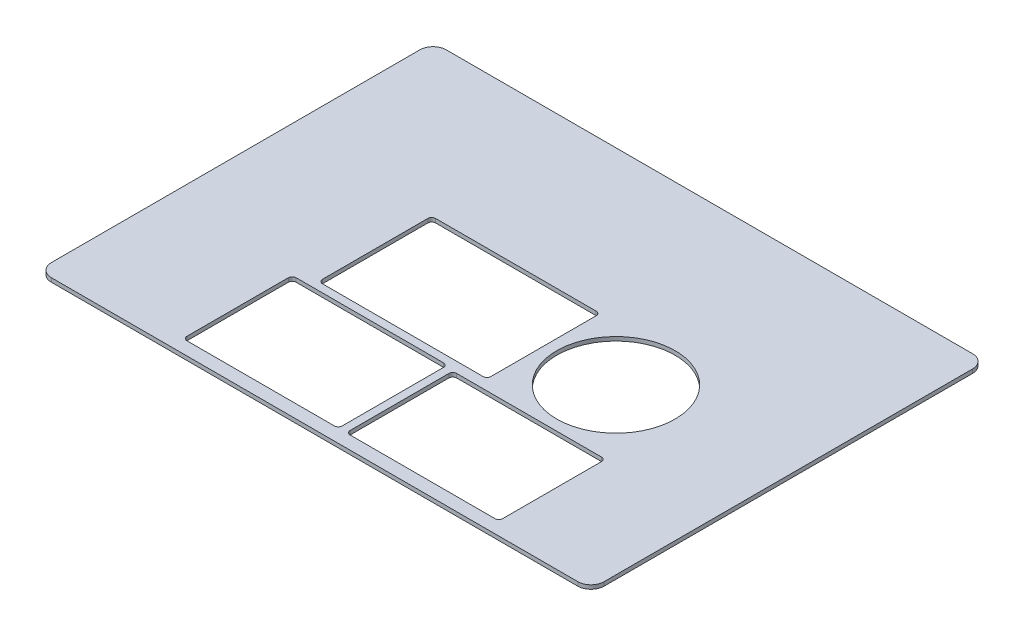
ISO-10303-21;
HEADER;
FILE_DESCRIPTION(('STEP AP214'),'2;1');
FILE_NAME('part.step','',(''),(''),'','','');
FILE_SCHEMA(('AUTOMOTIVE_DESIGN { 1 0 10303 214 1 1 1 1 }'));
ENDSEC;
DATA;
#1=APPLICATION_CONTEXT('core data for automotive mechanical design processes');
#2=APPLICATION_PROTOCOL_DEFINITION('international standard','automotive_design',2000,#1);
#3=PRODUCT_CONTEXT('',#1,'mechanical');
#4=PRODUCT('Part','Part','',(#3));
#5=PRODUCT_RELATED_PRODUCT_CATEGORY('part','',(#4));
#6=PRODUCT_DEFINITION_FORMATION('','',#4);
#7=PRODUCT_DEFINITION_CONTEXT('part definition',#1,'design');
#8=PRODUCT_DEFINITION('design','',#6,#7);
#9=PRODUCT_DEFINITION_SHAPE('','',#8);
#10=(LENGTH_UNIT() NAMED_UNIT(*) SI_UNIT(.MILLI.,.METRE.));
#11=(NAMED_UNIT(*) PLANE_ANGLE_UNIT() SI_UNIT($,.RADIAN.));
#12=(NAMED_UNIT(*) SI_UNIT($,.STERADIAN.) SOLID_ANGLE_UNIT());
#13=UNCERTAINTY_MEASURE_WITH_UNIT(LENGTH_MEASURE(1.E-05),#10,'distance_accuracy_value','');
#14=(GEOMETRIC_REPRESENTATION_CONTEXT(3) GLOBAL_UNCERTAINTY_ASSIGNED_CONTEXT((#13)) GLOBAL_UNIT_ASSIGNED_CONTEXT((#10,
#11,#12)) REPRESENTATION_CONTEXT('',''));
#15=CARTESIAN_POINT('',(0.,0.,0.));
#16=DIRECTION('',(0.,0.,1.));
#17=DIRECTION('',(1.,0.,0.));
#18=AXIS2_PLACEMENT_3D('',#15,#16,#17);
#19=CARTESIAN_POINT('',(-200.,3.,-140.));
#20=DIRECTION('',(0.,-1.,0.));
#21=DIRECTION('',(0.,0.,-1.));
#22=AXIS2_PLACEMENT_3D('',#19,#20,#21);
#23=CYLINDRICAL_SURFACE('',#22,10.);
#24=DIRECTION('',(0.,-1.,0.));
#25=VECTOR('',#24,1.);
#26=CARTESIAN_POINT('',(-210.,3.,-140.));
#27=LINE('',#26,#25);
#28=CARTESIAN_POINT('',(-210.,3.,-140.));
#29=VERTEX_POINT('',#28);
#30=CARTESIAN_POINT('',(-210.,0.,-140.));
#31=VERTEX_POINT('',#30);
#32=EDGE_CURVE('E581',#29,#31,#27,.T.);
#33=ORIENTED_EDGE('',*,*,#32,.F.);
#34=CARTESIAN_POINT('',(-200.,3.,-140.));
#35=DIRECTION('',(0.,-1.,0.));
#36=DIRECTION('',(0.,0.,-1.));
#37=AXIS2_PLACEMENT_3D('',#34,#35,#36);
#38=CIRCLE('',#37,10.);
#39=CARTESIAN_POINT('',(-200.,3.,-150.));
#40=VERTEX_POINT('',#39);
#41=EDGE_CURVE('E46',#40,#29,#38,.F.);
#42=ORIENTED_EDGE('',*,*,#41,.F.);
#43=DIRECTION('',(0.,-1.,0.));
#44=VECTOR('',#43,1.);
#45=CARTESIAN_POINT('',(-200.,3.,-150.));
#46=LINE('',#45,#44);
#47=CARTESIAN_POINT('',(-200.,0.,-150.));
#48=VERTEX_POINT('',#47);
#49=EDGE_CURVE('E585',#48,#40,#46,.F.);
#50=ORIENTED_EDGE('',*,*,#49,.F.);
#51=CARTESIAN_POINT('',(-200.,0.,-140.));
#52=DIRECTION('',(0.,-1.,0.));
#53=DIRECTION('',(0.,0.,-1.));
#54=AXIS2_PLACEMENT_3D('',#51,#52,#53);
#55=CIRCLE('',#54,10.);
#56=EDGE_CURVE('E11',#31,#48,#55,.T.);
#57=ORIENTED_EDGE('',*,*,#56,.F.);
#58=EDGE_LOOP('',(#33,#42,#50,#57));
#59=FACE_BOUND('',#58,.T.);
#60=ADVANCED_FACE('F38',(#59),#23,.T.);
#61=CARTESIAN_POINT('',(200.,3.,-140.));
#62=DIRECTION('',(0.,-1.,0.));
#63=DIRECTION('',(0.,0.,-1.));
#64=AXIS2_PLACEMENT_3D('',#61,#62,#63);
#65=CYLINDRICAL_SURFACE('',#64,10.);
#66=DIRECTION('',(0.,-1.,0.));
#67=VECTOR('',#66,1.);
#68=CARTESIAN_POINT('',(200.,3.,-150.));
#69=LINE('',#68,#67);
#70=CARTESIAN_POINT('',(200.,3.,-150.));
#71=VERTEX_POINT('',#70);
#72=CARTESIAN_POINT('',(200.,0.,-150.));
#73=VERTEX_POINT('',#72);
#74=EDGE_CURVE('E567',#71,#73,#69,.T.);
#75=ORIENTED_EDGE('',*,*,#74,.F.);
#76=CARTESIAN_POINT('',(200.,3.,-140.));
#77=DIRECTION('',(0.,-1.,0.));
#78=DIRECTION('',(0.,0.,-1.));
#79=AXIS2_PLACEMENT_3D('',#76,#77,#78);
#80=CIRCLE('',#79,10.);
#81=CARTESIAN_POINT('',(210.,3.,-140.));
#82=VERTEX_POINT('',#81);
#83=EDGE_CURVE('E575',#82,#71,#80,.F.);
#84=ORIENTED_EDGE('',*,*,#83,.F.);
#85=DIRECTION('',(0.,-1.,0.));
#86=VECTOR('',#85,1.);
#87=CARTESIAN_POINT('',(210.,3.,-140.));
#88=LINE('',#87,#86);
#89=CARTESIAN_POINT('',(210.,0.,-140.));
#90=VERTEX_POINT('',#89);
#91=EDGE_CURVE('E571',#90,#82,#88,.F.);
#92=ORIENTED_EDGE('',*,*,#91,.F.);
#93=CARTESIAN_POINT('',(200.,0.,-140.));
#94=DIRECTION('',(0.,-1.,0.));
#95=DIRECTION('',(0.,0.,-1.));
#96=AXIS2_PLACEMENT_3D('',#93,#94,#95);
#97=CIRCLE('',#96,10.);
#98=EDGE_CURVE('E578',#73,#90,#97,.T.);
#99=ORIENTED_EDGE('',*,*,#98,.F.);
#100=EDGE_LOOP('',(#75,#84,#92,#99));
#101=FACE_BOUND('',#100,.T.);
#102=ADVANCED_FACE('F615',(#101),#65,.T.);
#103=CARTESIAN_POINT('',(200.,3.,140.));
#104=DIRECTION('',(0.,1.,0.));
#105=DIRECTION('',(0.,0.,1.));
#106=AXIS2_PLACEMENT_3D('',#103,#104,#105);
#107=CYLINDRICAL_SURFACE('',#106,10.);
#108=DIRECTION('',(0.,1.,0.));
#109=VECTOR('',#108,1.);
#110=CARTESIAN_POINT('',(200.,3.,150.));
#111=LINE('',#110,#109);
#112=CARTESIAN_POINT('',(200.,0.,150.));
#113=VERTEX_POINT('',#112);
#114=CARTESIAN_POINT('',(200.,3.,150.));
#115=VERTEX_POINT('',#114);
#116=EDGE_CURVE('E553',#113,#115,#111,.T.);
#117=ORIENTED_EDGE('',*,*,#116,.F.);
#118=CARTESIAN_POINT('',(200.,0.,140.));
#119=DIRECTION('',(0.,-1.,0.));
#120=DIRECTION('',(0.,0.,-1.));
#121=AXIS2_PLACEMENT_3D('',#118,#119,#120);
#122=CIRCLE('',#121,10.);
#123=CARTESIAN_POINT('',(210.,0.,140.));
#124=VERTEX_POINT('',#123);
#125=EDGE_CURVE('E561',#124,#113,#122,.T.);
#126=ORIENTED_EDGE('',*,*,#125,.F.);
#127=DIRECTION('',(0.,1.,0.));
#128=VECTOR('',#127,1.);
#129=CARTESIAN_POINT('',(210.,3.,140.));
#130=LINE('',#129,#128);
#131=CARTESIAN_POINT('',(210.,3.,140.));
#132=VERTEX_POINT('',#131);
#133=EDGE_CURVE('E557',#132,#124,#130,.F.);
#134=ORIENTED_EDGE('',*,*,#133,.F.);
#135=CARTESIAN_POINT('',(200.,3.,140.));
#136=DIRECTION('',(0.,-1.,0.));
#137=DIRECTION('',(0.,0.,-1.));
#138=AXIS2_PLACEMENT_3D('',#135,#136,#137);
#139=CIRCLE('',#138,10.);
#140=EDGE_CURVE('E564',#115,#132,#139,.F.);
#141=ORIENTED_EDGE('',*,*,#140,.F.);
#142=EDGE_LOOP('',(#117,#126,#134,#141));
#143=FACE_BOUND('',#142,.T.);
#144=ADVANCED_FACE('F607',(#143),#107,.T.);
#145=CARTESIAN_POINT('',(-200.,3.,140.));
#146=DIRECTION('',(0.,-1.,0.));
#147=DIRECTION('',(0.,0.,-1.));
#148=AXIS2_PLACEMENT_3D('',#145,#146,#147);
#149=CYLINDRICAL_SURFACE('',#148,10.);
#150=DIRECTION('',(0.,-1.,0.));
#151=VECTOR('',#150,1.);
#152=CARTESIAN_POINT('',(-200.,3.,150.));
#153=LINE('',#152,#151);
#154=CARTESIAN_POINT('',(-200.,3.,150.));
#155=VERTEX_POINT('',#154);
#156=CARTESIAN_POINT('',(-200.,0.,150.));
#157=VERTEX_POINT('',#156);
#158=EDGE_CURVE('E538',#155,#157,#153,.T.);
#159=ORIENTED_EDGE('',*,*,#158,.F.);
#160=CARTESIAN_POINT('',(-200.,3.,140.));
#161=DIRECTION('',(0.,-1.,0.));
#162=DIRECTION('',(0.,0.,-1.));
#163=AXIS2_PLACEMENT_3D('',#160,#161,#162);
#164=CIRCLE('',#163,10.);
#165=CARTESIAN_POINT('',(-210.,3.,140.));
#166=VERTEX_POINT('',#165);
#167=EDGE_CURVE('E546',#166,#155,#164,.F.);
#168=ORIENTED_EDGE('',*,*,#167,.F.);
#169=DIRECTION('',(0.,-1.,0.));
#170=VECTOR('',#169,1.);
#171=CARTESIAN_POINT('',(-210.,3.,140.));
#172=LINE('',#171,#170);
#173=CARTESIAN_POINT('',(-210.,0.,140.));
#174=VERTEX_POINT('',#173);
#175=EDGE_CURVE('E542',#174,#166,#172,.F.);
#176=ORIENTED_EDGE('',*,*,#175,.F.);
#177=CARTESIAN_POINT('',(-200.,0.,140.));
#178=DIRECTION('',(0.,-1.,0.));
#179=DIRECTION('',(0.,0.,-1.));
#180=AXIS2_PLACEMENT_3D('',#177,#178,#179);
#181=CIRCLE('',#180,10.);
#182=EDGE_CURVE('E549',#157,#174,#181,.T.);
#183=ORIENTED_EDGE('',*,*,#182,.F.);
#184=EDGE_LOOP('',(#159,#168,#176,#183));
#185=FACE_BOUND('',#184,.T.);
#186=ADVANCED_FACE('F599',(#185),#149,.T.);
#187=CARTESIAN_POINT('',(-107.,3.,60.));
#188=DIRECTION('',(0.,1.,0.));
#189=DIRECTION('',(0.,0.,1.));
#190=AXIS2_PLACEMENT_3D('',#187,#188,#189);
#191=CYLINDRICAL_SURFACE('',#190,3.);
#192=DIRECTION('',(0.,-1.,0.));
#193=VECTOR('',#192,1.);
#194=CARTESIAN_POINT('',(-107.,3.,57.));
#195=LINE('',#194,#193);
#196=CARTESIAN_POINT('',(-107.,3.,57.));
#197=VERTEX_POINT('',#196);
#198=CARTESIAN_POINT('',(-107.,0.,57.));
#199=VERTEX_POINT('',#198);
#200=EDGE_CURVE('E524',#197,#199,#195,.T.);
#201=ORIENTED_EDGE('',*,*,#200,.F.);
#202=CARTESIAN_POINT('',(-107.,3.,60.));
#203=DIRECTION('',(0.,-1.,0.));
#204=DIRECTION('',(0.,0.,-1.));
#205=AXIS2_PLACEMENT_3D('',#202,#203,#204);
#206=CIRCLE('',#205,3.);
#207=CARTESIAN_POINT('',(-110.,3.,59.9999999999999));
#208=VERTEX_POINT('',#207);
#209=EDGE_CURVE('E532',#197,#208,#206,.F.);
#210=ORIENTED_EDGE('',*,*,#209,.T.);
#211=DIRECTION('',(0.,-1.,0.));
#212=VECTOR('',#211,1.);
#213=CARTESIAN_POINT('',(-110.,3.,60.));
#214=LINE('',#213,#212);
#215=CARTESIAN_POINT('',(-110.,0.,59.9999999999999));
#216=VERTEX_POINT('',#215);
#217=EDGE_CURVE('E528',#216,#208,#214,.F.);
#218=ORIENTED_EDGE('',*,*,#217,.F.);
#219=CARTESIAN_POINT('',(-107.,0.,60.));
#220=DIRECTION('',(0.,-1.,0.));
#221=DIRECTION('',(0.,0.,-1.));
#222=AXIS2_PLACEMENT_3D('',#219,#220,#221);
#223=CIRCLE('',#222,3.);
#224=EDGE_CURVE('E535',#216,#199,#223,.T.);
#225=ORIENTED_EDGE('',*,*,#224,.T.);
#226=EDGE_LOOP('',(#201,#210,#218,#225));
#227=FACE_BOUND('',#226,.T.);
#228=ADVANCED_FACE('F651',(#227),#191,.F.);
#229=CARTESIAN_POINT('',(-107.,3.,137.));
#230=DIRECTION('',(0.,1.,0.));
#231=DIRECTION('',(0.,0.,1.));
#232=AXIS2_PLACEMENT_3D('',#229,#230,#231);
#233=CYLINDRICAL_SURFACE('',#232,3.);
#234=DIRECTION('',(0.,-1.,0.));
#235=VECTOR('',#234,1.);
#236=CARTESIAN_POINT('',(-110.,3.,137.));
#237=LINE('',#236,#235);
#238=CARTESIAN_POINT('',(-110.,3.,137.));
#239=VERTEX_POINT('',#238);
#240=CARTESIAN_POINT('',(-110.,0.,137.));
#241=VERTEX_POINT('',#240);
#242=EDGE_CURVE('E509',#239,#241,#237,.T.);
#243=ORIENTED_EDGE('',*,*,#242,.F.);
#244=CARTESIAN_POINT('',(-107.,3.,137.));
#245=DIRECTION('',(0.,-1.,0.));
#246=DIRECTION('',(0.,0.,-1.));
#247=AXIS2_PLACEMENT_3D('',#244,#245,#246);
#248=CIRCLE('',#247,3.);
#249=CARTESIAN_POINT('',(-107.,3.,140.));
#250=VERTEX_POINT('',#249);
#251=EDGE_CURVE('E517',#239,#250,#248,.F.);
#252=ORIENTED_EDGE('',*,*,#251,.T.);
#253=DIRECTION('',(0.,-1.,0.));
#254=VECTOR('',#253,1.);
#255=CARTESIAN_POINT('',(-107.,3.,140.));
#256=LINE('',#255,#254);
#257=CARTESIAN_POINT('',(-107.,0.,140.));
#258=VERTEX_POINT('',#257);
#259=EDGE_CURVE('E513',#258,#250,#256,.F.);
#260=ORIENTED_EDGE('',*,*,#259,.F.);
#261=CARTESIAN_POINT('',(-107.,0.,137.));
#262=DIRECTION('',(0.,-1.,0.));
#263=DIRECTION('',(0.,0.,-1.));
#264=AXIS2_PLACEMENT_3D('',#261,#262,#263);
#265=CIRCLE('',#264,3.);
#266=EDGE_CURVE('E520',#258,#241,#265,.T.);
#267=ORIENTED_EDGE('',*,*,#266,.T.);
#268=EDGE_LOOP('',(#243,#252,#260,#267));
#269=FACE_BOUND('',#268,.T.);
#270=ADVANCED_FACE('F654',(#269),#233,.F.);
#271=CARTESIAN_POINT('',(5.,3.,60.));
#272=DIRECTION('',(0.,-1.,0.));
#273=DIRECTION('',(0.,0.,-1.));
#274=AXIS2_PLACEMENT_3D('',#271,#272,#273);
#275=CYLINDRICAL_SURFACE('',#274,3.);
#276=DIRECTION('',(0.,1.,0.));
#277=VECTOR('',#276,1.);
#278=CARTESIAN_POINT('',(5.,3.,57.));
#279=LINE('',#278,#277);
#280=CARTESIAN_POINT('',(4.99999999999999,0.,57.));
#281=VERTEX_POINT('',#280);
#282=CARTESIAN_POINT('',(4.99999999999999,3.,57.));
#283=VERTEX_POINT('',#282);
#284=EDGE_CURVE('E495',#281,#283,#279,.T.);
#285=ORIENTED_EDGE('',*,*,#284,.F.);
#286=CARTESIAN_POINT('',(5.,0.,60.));
#287=DIRECTION('',(0.,-1.,0.));
#288=DIRECTION('',(0.,0.,-1.));
#289=AXIS2_PLACEMENT_3D('',#286,#287,#288);
#290=CIRCLE('',#289,3.);
#291=CARTESIAN_POINT('',(8.,0.,59.9999999999999));
#292=VERTEX_POINT('',#291);
#293=EDGE_CURVE('E503',#281,#292,#290,.T.);
#294=ORIENTED_EDGE('',*,*,#293,.T.);
#295=DIRECTION('',(0.,1.,0.));
#296=VECTOR('',#295,1.);
#297=CARTESIAN_POINT('',(8.,3.,60.));
#298=LINE('',#297,#296);
#299=CARTESIAN_POINT('',(8.,3.,59.9999999999999));
#300=VERTEX_POINT('',#299);
#301=EDGE_CURVE('E499',#300,#292,#298,.F.);
#302=ORIENTED_EDGE('',*,*,#301,.F.);
#303=CARTESIAN_POINT('',(5.,3.,60.));
#304=DIRECTION('',(0.,-1.,0.));
#305=DIRECTION('',(0.,0.,-1.));
#306=AXIS2_PLACEMENT_3D('',#303,#304,#305);
#307=CIRCLE('',#306,3.);
#308=EDGE_CURVE('E506',#300,#283,#307,.F.);
#309=ORIENTED_EDGE('',*,*,#308,.T.);
#310=EDGE_LOOP('',(#285,#294,#302,#309));
#311=FACE_BOUND('',#310,.T.);
#312=ADVANCED_FACE('F658',(#311),#275,.F.);
#313=CARTESIAN_POINT('',(5.,3.,137.));
#314=DIRECTION('',(0.,-1.,0.));
#315=DIRECTION('',(0.,0.,-1.));
#316=AXIS2_PLACEMENT_3D('',#313,#314,#315);
#317=CYLINDRICAL_SURFACE('',#316,3.);
#318=DIRECTION('',(0.,1.,0.));
#319=VECTOR('',#318,1.);
#320=CARTESIAN_POINT('',(8.,3.,137.));
#321=LINE('',#320,#319);
#322=CARTESIAN_POINT('',(8.,0.,137.));
#323=VERTEX_POINT('',#322);
#324=CARTESIAN_POINT('',(8.,3.,137.));
#325=VERTEX_POINT('',#324);
#326=EDGE_CURVE('E480',#323,#325,#321,.T.);
#327=ORIENTED_EDGE('',*,*,#326,.F.);
#328=CARTESIAN_POINT('',(5.,0.,137.));
#329=DIRECTION('',(0.,-1.,0.));
#330=DIRECTION('',(0.,0.,-1.));
#331=AXIS2_PLACEMENT_3D('',#328,#329,#330);
#332=CIRCLE('',#331,3.);
#333=CARTESIAN_POINT('',(4.99999999999999,0.,140.));
#334=VERTEX_POINT('',#333);
#335=EDGE_CURVE('E488',#323,#334,#332,.T.);
#336=ORIENTED_EDGE('',*,*,#335,.T.);
#337=DIRECTION('',(0.,1.,0.));
#338=VECTOR('',#337,1.);
#339=CARTESIAN_POINT('',(5.,3.,140.));
#340=LINE('',#339,#338);
#341=CARTESIAN_POINT('',(4.99999999999999,3.,140.));
#342=VERTEX_POINT('',#341);
#343=EDGE_CURVE('E484',#342,#334,#340,.F.);
#344=ORIENTED_EDGE('',*,*,#343,.F.);
#345=CARTESIAN_POINT('',(5.,3.,137.));
#346=DIRECTION('',(0.,-1.,0.));
#347=DIRECTION('',(0.,0.,-1.));
#348=AXIS2_PLACEMENT_3D('',#345,#346,#347);
#349=CIRCLE('',#348,3.);
#350=EDGE_CURVE('E492',#342,#325,#349,.F.);
#351=ORIENTED_EDGE('',*,*,#350,.T.);
#352=EDGE_LOOP('',(#327,#336,#344,#351));
#353=FACE_BOUND('',#352,.T.);
#354=ADVANCED_FACE('F662',(#353),#317,.F.);
#355=CARTESIAN_POINT('',(127.,3.,137.));
#356=DIRECTION('',(0.,-1.,0.));
#357=DIRECTION('',(0.,0.,-1.));
#358=AXIS2_PLACEMENT_3D('',#355,#356,#357);
#359=CYLINDRICAL_SURFACE('',#358,3.);
#360=DIRECTION('',(0.,1.,0.));
#361=VECTOR('',#360,1.);
#362=CARTESIAN_POINT('',(130.,3.,137.));
#363=LINE('',#362,#361);
#364=CARTESIAN_POINT('',(130.,0.,137.));
#365=VERTEX_POINT('',#364);
#366=CARTESIAN_POINT('',(130.,3.,137.));
#367=VERTEX_POINT('',#366);
#368=EDGE_CURVE('E466',#365,#367,#363,.T.);
#369=ORIENTED_EDGE('',*,*,#368,.F.);
#370=CARTESIAN_POINT('',(127.,0.,137.));
#371=DIRECTION('',(0.,-1.,0.));
#372=DIRECTION('',(0.,0.,-1.));
#373=AXIS2_PLACEMENT_3D('',#370,#371,#372);
#374=CIRCLE('',#373,3.);
#375=CARTESIAN_POINT('',(127.,0.,140.));
#376=VERTEX_POINT('',#375);
#377=EDGE_CURVE('E474',#365,#376,#374,.T.);
#378=ORIENTED_EDGE('',*,*,#377,.T.);
#379=DIRECTION('',(0.,1.,0.));
#380=VECTOR('',#379,1.);
#381=CARTESIAN_POINT('',(127.,3.,140.));
#382=LINE('',#381,#380);
#383=CARTESIAN_POINT('',(127.,3.,140.));
#384=VERTEX_POINT('',#383);
#385=EDGE_CURVE('E470',#384,#376,#382,.F.);
#386=ORIENTED_EDGE('',*,*,#385,.F.);
#387=CARTESIAN_POINT('',(127.,3.,137.));
#388=DIRECTION('',(0.,-1.,0.));
#389=DIRECTION('',(0.,0.,-1.));
#390=AXIS2_PLACEMENT_3D('',#387,#388,#389);
#391=CIRCLE('',#390,3.);
#392=EDGE_CURVE('E477',#384,#367,#391,.F.);
#393=ORIENTED_EDGE('',*,*,#392,.T.);
#394=EDGE_LOOP('',(#369,#378,#386,#393));
#395=FACE_BOUND('',#394,.T.);
#396=ADVANCED_FACE('F666',(#395),#359,.F.);
#397=CARTESIAN_POINT('',(127.,3.,62.));
#398=DIRECTION('',(0.,1.,0.));
#399=DIRECTION('',(0.,0.,1.));
#400=AXIS2_PLACEMENT_3D('',#397,#398,#399);
#401=CYLINDRICAL_SURFACE('',#400,3.);
#402=DIRECTION('',(0.,-1.,0.));
#403=VECTOR('',#402,1.);
#404=CARTESIAN_POINT('',(130.,3.,62.));
#405=LINE('',#404,#403);
#406=CARTESIAN_POINT('',(130.,3.,62.));
#407=VERTEX_POINT('',#406);
#408=CARTESIAN_POINT('',(130.,0.,62.));
#409=VERTEX_POINT('',#408);
#410=EDGE_CURVE('E451',#407,#409,#405,.T.);
#411=ORIENTED_EDGE('',*,*,#410,.F.);
#412=CARTESIAN_POINT('',(127.,3.,62.));
#413=DIRECTION('',(0.,-1.,0.));
#414=DIRECTION('',(0.,0.,-1.));
#415=AXIS2_PLACEMENT_3D('',#412,#413,#414);
#416=CIRCLE('',#415,3.);
#417=CARTESIAN_POINT('',(127.,3.,59.));
#418=VERTEX_POINT('',#417);
#419=EDGE_CURVE('E459',#407,#418,#416,.F.);
#420=ORIENTED_EDGE('',*,*,#419,.T.);
#421=DIRECTION('',(0.,-1.,0.));
#422=VECTOR('',#421,1.);
#423=CARTESIAN_POINT('',(127.,3.,59.));
#424=LINE('',#423,#422);
#425=CARTESIAN_POINT('',(127.,0.,59.));
#426=VERTEX_POINT('',#425);
#427=EDGE_CURVE('E455',#426,#418,#424,.F.);
#428=ORIENTED_EDGE('',*,*,#427,.F.);
#429=CARTESIAN_POINT('',(127.,0.,62.));
#430=DIRECTION('',(0.,-1.,0.));
#431=DIRECTION('',(0.,0.,-1.));
#432=AXIS2_PLACEMENT_3D('',#429,#430,#431);
#433=CIRCLE('',#432,3.);
#434=EDGE_CURVE('E462',#426,#409,#433,.T.);
#435=ORIENTED_EDGE('',*,*,#434,.T.);
#436=EDGE_LOOP('',(#411,#420,#428,#435));
#437=FACE_BOUND('',#436,.T.);
#438=ADVANCED_FACE('F670',(#437),#401,.F.);
#439=CARTESIAN_POINT('',(17.,3.,62.));
#440=DIRECTION('',(0.,1.,0.));
#441=DIRECTION('',(0.,0.,1.));
#442=AXIS2_PLACEMENT_3D('',#439,#440,#441);
#443=CYLINDRICAL_SURFACE('',#442,3.);
#444=DIRECTION('',(0.,-1.,0.));
#445=VECTOR('',#444,1.);
#446=CARTESIAN_POINT('',(17.,3.,59.));
#447=LINE('',#446,#445);
#448=CARTESIAN_POINT('',(17.,3.,59.));
#449=VERTEX_POINT('',#448);
#450=CARTESIAN_POINT('',(17.,0.,59.));
#451=VERTEX_POINT('',#450);
#452=EDGE_CURVE('E436',#449,#451,#447,.T.);
#453=ORIENTED_EDGE('',*,*,#452,.F.);
#454=CARTESIAN_POINT('',(17.,3.,62.));
#455=DIRECTION('',(0.,-1.,0.));
#456=DIRECTION('',(0.,0.,-1.));
#457=AXIS2_PLACEMENT_3D('',#454,#455,#456);
#458=CIRCLE('',#457,3.);
#459=CARTESIAN_POINT('',(14.,3.,62.));
#460=VERTEX_POINT('',#459);
#461=EDGE_CURVE('E444',#449,#460,#458,.F.);
#462=ORIENTED_EDGE('',*,*,#461,.T.);
#463=DIRECTION('',(0.,-1.,0.));
#464=VECTOR('',#463,1.);
#465=CARTESIAN_POINT('',(14.,3.,62.));
#466=LINE('',#465,#464);
#467=CARTESIAN_POINT('',(14.,0.,62.));
#468=VERTEX_POINT('',#467);
#469=EDGE_CURVE('E440',#468,#460,#466,.F.);
#470=ORIENTED_EDGE('',*,*,#469,.F.);
#471=CARTESIAN_POINT('',(17.,0.,62.));
#472=DIRECTION('',(0.,-1.,0.));
#473=DIRECTION('',(0.,0.,-1.));
#474=AXIS2_PLACEMENT_3D('',#471,#472,#473);
#475=CIRCLE('',#474,3.);
#476=EDGE_CURVE('E447',#468,#451,#475,.T.);
#477=ORIENTED_EDGE('',*,*,#476,.T.);
#478=EDGE_LOOP('',(#453,#462,#470,#477));
#479=FACE_BOUND('',#478,.T.);
#480=ADVANCED_FACE('F674',(#479),#443,.F.);
#481=CARTESIAN_POINT('',(17.,3.,137.));
#482=DIRECTION('',(0.,1.,0.));
#483=DIRECTION('',(0.,0.,1.));
#484=AXIS2_PLACEMENT_3D('',#481,#482,#483);
#485=CYLINDRICAL_SURFACE('',#484,3.);
#486=DIRECTION('',(0.,-1.,0.));
#487=VECTOR('',#486,1.);
#488=CARTESIAN_POINT('',(14.,3.,137.));
#489=LINE('',#488,#487);
#490=CARTESIAN_POINT('',(14.,3.,137.));
#491=VERTEX_POINT('',#490);
#492=CARTESIAN_POINT('',(14.,0.,137.));
#493=VERTEX_POINT('',#492);
#494=EDGE_CURVE('E421',#491,#493,#489,.T.);
#495=ORIENTED_EDGE('',*,*,#494,.F.);
#496=CARTESIAN_POINT('',(17.,3.,137.));
#497=DIRECTION('',(0.,-1.,0.));
#498=DIRECTION('',(0.,0.,-1.));
#499=AXIS2_PLACEMENT_3D('',#496,#497,#498);
#500=CIRCLE('',#499,3.);
#501=CARTESIAN_POINT('',(17.,3.,140.));
#502=VERTEX_POINT('',#501);
#503=EDGE_CURVE('E429',#491,#502,#500,.F.);
#504=ORIENTED_EDGE('',*,*,#503,.T.);
#505=DIRECTION('',(0.,-1.,0.));
#506=VECTOR('',#505,1.);
#507=CARTESIAN_POINT('',(17.,3.,140.));
#508=LINE('',#507,#506);
#509=CARTESIAN_POINT('',(17.,0.,140.));
#510=VERTEX_POINT('',#509);
#511=EDGE_CURVE('E425',#510,#502,#508,.F.);
#512=ORIENTED_EDGE('',*,*,#511,.F.);
#513=CARTESIAN_POINT('',(17.,0.,137.));
#514=DIRECTION('',(0.,-1.,0.));
#515=DIRECTION('',(0.,0.,-1.));
#516=AXIS2_PLACEMENT_3D('',#513,#514,#515);
#517=CIRCLE('',#516,3.);
#518=EDGE_CURVE('E432',#510,#493,#517,.T.);
#519=ORIENTED_EDGE('',*,*,#518,.T.);
#520=EDGE_LOOP('',(#495,#504,#512,#519));
#521=FACE_BOUND('',#520,.T.);
#522=ADVANCED_FACE('F678',(#521),#485,.F.);
#523=CARTESIAN_POINT('',(29.,3.,-32.));
#524=DIRECTION('',(0.,-1.,0.));
#525=DIRECTION('',(0.,0.,-1.));
#526=AXIS2_PLACEMENT_3D('',#523,#524,#525);
#527=CYLINDRICAL_SURFACE('',#526,3.);
#528=DIRECTION('',(0.,1.,0.));
#529=VECTOR('',#528,1.);
#530=CARTESIAN_POINT('',(29.,3.,-35.));
#531=LINE('',#530,#529);
#532=CARTESIAN_POINT('',(29.,0.,-35.));
#533=VERTEX_POINT('',#532);
#534=CARTESIAN_POINT('',(29.,3.,-35.));
#535=VERTEX_POINT('',#534);
#536=EDGE_CURVE('E407',#533,#535,#531,.T.);
#537=ORIENTED_EDGE('',*,*,#536,.F.);
#538=CARTESIAN_POINT('',(29.,0.,-32.));
#539=DIRECTION('',(0.,-1.,0.));
#540=DIRECTION('',(0.,0.,-1.));
#541=AXIS2_PLACEMENT_3D('',#538,#539,#540);
#542=CIRCLE('',#541,3.);
#543=CARTESIAN_POINT('',(32.,0.,-32.));
#544=VERTEX_POINT('',#543);
#545=EDGE_CURVE('E415',#533,#544,#542,.T.);
#546=ORIENTED_EDGE('',*,*,#545,.T.);
#547=DIRECTION('',(0.,1.,0.));
#548=VECTOR('',#547,1.);
#549=CARTESIAN_POINT('',(32.,3.,-32.));
#550=LINE('',#549,#548);
#551=CARTESIAN_POINT('',(32.,3.,-32.));
#552=VERTEX_POINT('',#551);
#553=EDGE_CURVE('E411',#552,#544,#550,.F.);
#554=ORIENTED_EDGE('',*,*,#553,.F.);
#555=CARTESIAN_POINT('',(29.,3.,-32.));
#556=DIRECTION('',(0.,-1.,0.));
#557=DIRECTION('',(0.,0.,-1.));
#558=AXIS2_PLACEMENT_3D('',#555,#556,#557);
#559=CIRCLE('',#558,3.);
#560=EDGE_CURVE('E418',#552,#535,#559,.F.);
#561=ORIENTED_EDGE('',*,*,#560,.T.);
#562=EDGE_LOOP('',(#537,#546,#554,#561));
#563=FACE_BOUND('',#562,.T.);
#564=ADVANCED_FACE('F682',(#563),#527,.F.);
#565=CARTESIAN_POINT('',(29.,3.,48.));
#566=DIRECTION('',(0.,1.,0.));
#567=DIRECTION('',(0.,0.,1.));
#568=AXIS2_PLACEMENT_3D('',#565,#566,#567);
#569=CYLINDRICAL_SURFACE('',#568,3.);
#570=DIRECTION('',(0.,-1.,0.));
#571=VECTOR('',#570,1.);
#572=CARTESIAN_POINT('',(29.,3.,51.));
#573=LINE('',#572,#571);
#574=CARTESIAN_POINT('',(29.,3.,51.));
#575=VERTEX_POINT('',#574);
#576=CARTESIAN_POINT('',(29.,0.,51.));
#577=VERTEX_POINT('',#576);
#578=EDGE_CURVE('E393',#575,#577,#573,.T.);
#579=ORIENTED_EDGE('',*,*,#578,.F.);
#580=CARTESIAN_POINT('',(29.,3.,48.));
#581=DIRECTION('',(0.,-1.,0.));
#582=DIRECTION('',(0.,0.,-1.));
#583=AXIS2_PLACEMENT_3D('',#580,#581,#582);
#584=CIRCLE('',#583,3.);
#585=CARTESIAN_POINT('',(32.,3.,48.));
#586=VERTEX_POINT('',#585);
#587=EDGE_CURVE('E401',#575,#586,#584,.F.);
#588=ORIENTED_EDGE('',*,*,#587,.T.);
#589=DIRECTION('',(0.,-1.,0.));
#590=VECTOR('',#589,1.);
#591=CARTESIAN_POINT('',(32.,3.,48.));
#592=LINE('',#591,#590);
#593=CARTESIAN_POINT('',(32.,0.,48.));
#594=VERTEX_POINT('',#593);
#595=EDGE_CURVE('E397',#594,#586,#592,.F.);
#596=ORIENTED_EDGE('',*,*,#595,.F.);
#597=CARTESIAN_POINT('',(29.,0.,48.));
#598=DIRECTION('',(0.,-1.,0.));
#599=DIRECTION('',(0.,0.,-1.));
#600=AXIS2_PLACEMENT_3D('',#597,#598,#599);
#601=CIRCLE('',#600,3.);
#602=EDGE_CURVE('E404',#594,#577,#601,.T.);
#603=ORIENTED_EDGE('',*,*,#602,.T.);
#604=EDGE_LOOP('',(#579,#588,#596,#603));
#605=FACE_BOUND('',#604,.T.);
#606=ADVANCED_FACE('F686',(#605),#569,.F.);
#607=CARTESIAN_POINT('',(-93.,3.,48.));
#608=DIRECTION('',(0.,1.,0.));
#609=DIRECTION('',(0.,0.,1.));
#610=AXIS2_PLACEMENT_3D('',#607,#608,#609);
#611=CYLINDRICAL_SURFACE('',#610,3.);
#612=DIRECTION('',(0.,-1.,0.));
#613=VECTOR('',#612,1.);
#614=CARTESIAN_POINT('',(-96.,3.,48.));
#615=LINE('',#614,#613);
#616=CARTESIAN_POINT('',(-96.,3.,48.));
#617=VERTEX_POINT('',#616);
#618=CARTESIAN_POINT('',(-96.,0.,48.));
#619=VERTEX_POINT('',#618);
#620=EDGE_CURVE('E272',#617,#619,#615,.T.);
#621=ORIENTED_EDGE('',*,*,#620,.F.);
#622=CARTESIAN_POINT('',(-93.,3.,48.));
#623=DIRECTION('',(0.,-1.,0.));
#624=DIRECTION('',(0.,0.,-1.));
#625=AXIS2_PLACEMENT_3D('',#622,#623,#624);
#626=CIRCLE('',#625,3.);
#627=CARTESIAN_POINT('',(-93.,3.,51.));
#628=VERTEX_POINT('',#627);
#629=EDGE_CURVE('E387',#617,#628,#626,.F.);
#630=ORIENTED_EDGE('',*,*,#629,.T.);
#631=DIRECTION('',(0.,-1.,0.));
#632=VECTOR('',#631,1.);
#633=CARTESIAN_POINT('',(-93.,3.,51.));
#634=LINE('',#633,#632);
#635=CARTESIAN_POINT('',(-93.,0.,51.));
#636=VERTEX_POINT('',#635);
#637=EDGE_CURVE('E383',#636,#628,#634,.F.);
#638=ORIENTED_EDGE('',*,*,#637,.F.);
#639=CARTESIAN_POINT('',(-93.,0.,48.));
#640=DIRECTION('',(0.,-1.,0.));
#641=DIRECTION('',(0.,0.,-1.));
#642=AXIS2_PLACEMENT_3D('',#639,#640,#641);
#643=CIRCLE('',#642,3.);
#644=EDGE_CURVE('E390',#636,#619,#643,.T.);
#645=ORIENTED_EDGE('',*,*,#644,.T.);
#646=EDGE_LOOP('',(#621,#630,#638,#645));
#647=FACE_BOUND('',#646,.T.);
#648=ADVANCED_FACE('F690',(#647),#611,.F.);
#649=CARTESIAN_POINT('',(-93.,3.,-32.));
#650=DIRECTION('',(0.,-1.,0.));
#651=DIRECTION('',(0.,0.,-1.));
#652=AXIS2_PLACEMENT_3D('',#649,#650,#651);
#653=CYLINDRICAL_SURFACE('',#652,3.);
#654=DIRECTION('',(0.,1.,0.));
#655=VECTOR('',#654,1.);
#656=CARTESIAN_POINT('',(-96.,3.,-32.));
#657=LINE('',#656,#655);
#658=CARTESIAN_POINT('',(-96.,0.,-32.));
#659=VERTEX_POINT('',#658);
#660=CARTESIAN_POINT('',(-96.,3.,-32.));
#661=VERTEX_POINT('',#660);
#662=EDGE_CURVE('E260',#659,#661,#657,.T.);
#663=ORIENTED_EDGE('',*,*,#662,.F.);
#664=CARTESIAN_POINT('',(-93.,0.,-32.));
#665=DIRECTION('',(0.,-1.,0.));
#666=DIRECTION('',(0.,0.,-1.));
#667=AXIS2_PLACEMENT_3D('',#664,#665,#666);
#668=CIRCLE('',#667,3.);
#669=CARTESIAN_POINT('',(-93.,0.,-35.));
#670=VERTEX_POINT('',#669);
#671=EDGE_CURVE('E245',#659,#670,#668,.T.);
#672=ORIENTED_EDGE('',*,*,#671,.T.);
#673=DIRECTION('',(0.,1.,0.));
#674=VECTOR('',#673,1.);
#675=CARTESIAN_POINT('',(-93.,3.,-35.));
#676=LINE('',#675,#674);
#677=CARTESIAN_POINT('',(-93.,3.,-35.));
#678=VERTEX_POINT('',#677);
#679=EDGE_CURVE('E257',#678,#670,#676,.F.);
#680=ORIENTED_EDGE('',*,*,#679,.F.);
#681=CARTESIAN_POINT('',(-93.,3.,-32.));
#682=DIRECTION('',(0.,-1.,0.));
#683=DIRECTION('',(0.,0.,-1.));
#684=AXIS2_PLACEMENT_3D('',#681,#682,#683);
#685=CIRCLE('',#684,3.);
#686=EDGE_CURVE('E256',#678,#661,#685,.F.);
#687=ORIENTED_EDGE('',*,*,#686,.T.);
#688=EDGE_LOOP('',(#663,#672,#680,#687));
#689=FACE_BOUND('',#688,.T.);
#690=ADVANCED_FACE('F261',(#689),#653,.F.);
#691=CARTESIAN_POINT('',(0.,3.,0.));
#692=DIRECTION('',(0.,-1.,0.));
#693=DIRECTION('',(0.,0.,-1.));
#694=AXIS2_PLACEMENT_3D('',#691,#692,#693);
#695=PLANE('',#694);
#696=CARTESIAN_POINT('',(85.,3.,5.99999999999998));
#697=DIRECTION('',(0.,1.,0.));
#698=DIRECTION('',(0.,0.,1.));
#699=AXIS2_PLACEMENT_3D('',#696,#697,#698);
#700=CIRCLE('',#699,45.);
#701=CARTESIAN_POINT('',(85.,3.,51.));
#702=VERTEX_POINT('',#701);
#703=EDGE_CURVE('E285',#702,#702,#700,.T.);
#704=ORIENTED_EDGE('',*,*,#703,.F.);
#705=EDGE_LOOP('',(#704));
#706=FACE_BOUND('',#705,.T.);
#707=DIRECTION('',(0.,0.,-1.));
#708=VECTOR('',#707,1.);
#709=CARTESIAN_POINT('',(8.,3.,140.));
#710=LINE('',#709,#708);
#711=EDGE_CURVE('E295',#325,#300,#710,.T.);
#712=ORIENTED_EDGE('',*,*,#711,.F.);
#713=ORIENTED_EDGE('',*,*,#350,.F.);
#714=DIRECTION('',(1.,0.,0.));
#715=VECTOR('',#714,1.);
#716=CARTESIAN_POINT('',(-110.,3.,140.));
#717=LINE('',#716,#715);
#718=EDGE_CURVE('E307',#250,#342,#717,.T.);
#719=ORIENTED_EDGE('',*,*,#718,.F.);
#720=ORIENTED_EDGE('',*,*,#251,.F.);
#721=DIRECTION('',(0.,0.,1.));
#722=VECTOR('',#721,1.);
#723=CARTESIAN_POINT('',(-110.,3.,140.));
#724=LINE('',#723,#722);
#725=EDGE_CURVE('E304',#208,#239,#724,.T.);
#726=ORIENTED_EDGE('',*,*,#725,.F.);
#727=ORIENTED_EDGE('',*,*,#209,.F.);
#728=DIRECTION('',(-1.,0.,0.));
#729=VECTOR('',#728,1.);
#730=CARTESIAN_POINT('',(-110.,3.,57.));
#731=LINE('',#730,#729);
#732=EDGE_CURVE('E299',#283,#197,#731,.T.);
#733=ORIENTED_EDGE('',*,*,#732,.F.);
#734=ORIENTED_EDGE('',*,*,#308,.F.);
#735=EDGE_LOOP('',(#712,#713,#719,#720,#726,#727,#733,#734));
#736=FACE_BOUND('',#735,.T.);
#737=DIRECTION('',(-1.,0.,0.));
#738=VECTOR('',#737,1.);
#739=CARTESIAN_POINT('',(-210.,3.,-150.));
#740=LINE('',#739,#738);
#741=EDGE_CURVE('E353',#71,#40,#740,.T.);
#742=ORIENTED_EDGE('',*,*,#741,.T.);
#743=ORIENTED_EDGE('',*,*,#41,.T.);
#744=DIRECTION('',(0.,0.,1.));
#745=VECTOR('',#744,1.);
#746=CARTESIAN_POINT('',(-210.,3.,150.));
#747=LINE('',#746,#745);
#748=EDGE_CURVE('E358',#29,#166,#747,.T.);
#749=ORIENTED_EDGE('',*,*,#748,.T.);
#750=ORIENTED_EDGE('',*,*,#167,.T.);
#751=DIRECTION('',(1.,0.,0.));
#752=VECTOR('',#751,1.);
#753=CARTESIAN_POINT('',(-210.,3.,150.));
#754=LINE('',#753,#752);
#755=EDGE_CURVE('E267',#155,#115,#754,.T.);
#756=ORIENTED_EDGE('',*,*,#755,.T.);
#757=ORIENTED_EDGE('',*,*,#140,.T.);
#758=DIRECTION('',(0.,0.,-1.));
#759=VECTOR('',#758,1.);
#760=CARTESIAN_POINT('',(210.,3.,150.));
#761=LINE('',#760,#759);
#762=EDGE_CURVE('E349',#132,#82,#761,.T.);
#763=ORIENTED_EDGE('',*,*,#762,.T.);
#764=ORIENTED_EDGE('',*,*,#83,.T.);
#765=EDGE_LOOP('',(#742,#743,#749,#750,#756,#757,#763,#764));
#766=FACE_BOUND('',#765,.T.);
#767=DIRECTION('',(0.,0.,-1.));
#768=VECTOR('',#767,1.);
#769=CARTESIAN_POINT('',(130.,3.,140.));
#770=LINE('',#769,#768);
#771=EDGE_CURVE('E323',#367,#407,#770,.T.);
#772=ORIENTED_EDGE('',*,*,#771,.F.);
#773=ORIENTED_EDGE('',*,*,#392,.F.);
#774=DIRECTION('',(1.,0.,0.));
#775=VECTOR('',#774,1.);
#776=CARTESIAN_POINT('',(14.,3.,140.));
#777=LINE('',#776,#775);
#778=EDGE_CURVE('E333',#502,#384,#777,.T.);
#779=ORIENTED_EDGE('',*,*,#778,.F.);
#780=ORIENTED_EDGE('',*,*,#503,.F.);
#781=DIRECTION('',(0.,0.,1.));
#782=VECTOR('',#781,1.);
#783=CARTESIAN_POINT('',(14.,3.,140.));
#784=LINE('',#783,#782);
#785=EDGE_CURVE('E330',#460,#491,#784,.T.);
#786=ORIENTED_EDGE('',*,*,#785,.F.);
#787=ORIENTED_EDGE('',*,*,#461,.F.);
#788=DIRECTION('',(-1.,0.,0.));
#789=VECTOR('',#788,1.);
#790=CARTESIAN_POINT('',(14.,3.,59.));
#791=LINE('',#790,#789);
#792=EDGE_CURVE('E326',#418,#449,#791,.T.);
#793=ORIENTED_EDGE('',*,*,#792,.F.);
#794=ORIENTED_EDGE('',*,*,#419,.F.);
#795=EDGE_LOOP('',(#772,#773,#779,#780,#786,#787,#793,#794));
#796=FACE_BOUND('',#795,.T.);
#797=DIRECTION('',(0.,0.,-1.));
#798=VECTOR('',#797,1.);
#799=CARTESIAN_POINT('',(32.,3.,51.));
#800=LINE('',#799,#798);
#801=EDGE_CURVE('E279',#586,#552,#800,.T.);
#802=ORIENTED_EDGE('',*,*,#801,.F.);
#803=ORIENTED_EDGE('',*,*,#587,.F.);
#804=DIRECTION('',(1.,0.,0.));
#805=VECTOR('',#804,1.);
#806=CARTESIAN_POINT('',(-96.,3.,51.));
#807=LINE('',#806,#805);
#808=EDGE_CURVE('E294',#628,#575,#807,.T.);
#809=ORIENTED_EDGE('',*,*,#808,.F.);
#810=ORIENTED_EDGE('',*,*,#629,.F.);
#811=DIRECTION('',(0.,0.,1.));
#812=VECTOR('',#811,1.);
#813=CARTESIAN_POINT('',(-96.,3.,51.));
#814=LINE('',#813,#812);
#815=EDGE_CURVE('E786',#661,#617,#814,.T.);
#816=ORIENTED_EDGE('',*,*,#815,.F.);
#817=ORIENTED_EDGE('',*,*,#686,.F.);
#818=DIRECTION('',(-1.,0.,0.));
#819=VECTOR('',#818,1.);
#820=CARTESIAN_POINT('',(-96.,3.,-35.));
#821=LINE('',#820,#819);
#822=EDGE_CURVE('E783',#535,#678,#821,.T.);
#823=ORIENTED_EDGE('',*,*,#822,.F.);
#824=ORIENTED_EDGE('',*,*,#560,.F.);
#825=EDGE_LOOP('',(#802,#803,#809,#810,#816,#817,#823,#824));
#826=FACE_BOUND('',#825,.T.);
#827=ADVANCED_FACE('F589',(#706,#736,#766,#796,#826),#695,.F.);
#828=CARTESIAN_POINT('',(0.,0.,0.));
#829=DIRECTION('',(0.,-1.,0.));
#830=DIRECTION('',(0.,0.,-1.));
#831=AXIS2_PLACEMENT_3D('',#828,#829,#830);
#832=PLANE('',#831);
#833=ORIENTED_EDGE('',*,*,#224,.F.);
#834=DIRECTION('',(0.,0.,1.));
#835=VECTOR('',#834,1.);
#836=CARTESIAN_POINT('',(-110.,0.,140.));
#837=LINE('',#836,#835);
#838=EDGE_CURVE('E318',#216,#241,#837,.T.);
#839=ORIENTED_EDGE('',*,*,#838,.T.);
#840=ORIENTED_EDGE('',*,*,#266,.F.);
#841=DIRECTION('',(1.,0.,0.));
#842=VECTOR('',#841,1.);
#843=CARTESIAN_POINT('',(-110.,0.,140.));
#844=LINE('',#843,#842);
#845=EDGE_CURVE('E300',#258,#334,#844,.T.);
#846=ORIENTED_EDGE('',*,*,#845,.T.);
#847=ORIENTED_EDGE('',*,*,#335,.F.);
#848=DIRECTION('',(0.,0.,-1.));
#849=VECTOR('',#848,1.);
#850=CARTESIAN_POINT('',(8.,0.,140.));
#851=LINE('',#850,#849);
#852=EDGE_CURVE('E289',#323,#292,#851,.T.);
#853=ORIENTED_EDGE('',*,*,#852,.T.);
#854=ORIENTED_EDGE('',*,*,#293,.F.);
#855=DIRECTION('',(-1.,0.,0.));
#856=VECTOR('',#855,1.);
#857=CARTESIAN_POINT('',(-110.,0.,57.));
#858=LINE('',#857,#856);
#859=EDGE_CURVE('E314',#281,#199,#858,.T.);
#860=ORIENTED_EDGE('',*,*,#859,.T.);
#861=EDGE_LOOP('',(#833,#839,#840,#846,#847,#853,#854,#860));
#862=FACE_BOUND('',#861,.T.);
#863=ORIENTED_EDGE('',*,*,#377,.F.);
#864=DIRECTION('',(0.,0.,-1.));
#865=VECTOR('',#864,1.);
#866=CARTESIAN_POINT('',(130.,0.,140.));
#867=LINE('',#866,#865);
#868=EDGE_CURVE('E310',#365,#409,#867,.T.);
#869=ORIENTED_EDGE('',*,*,#868,.T.);
#870=ORIENTED_EDGE('',*,*,#434,.F.);
#871=DIRECTION('',(-1.,0.,0.));
#872=VECTOR('',#871,1.);
#873=CARTESIAN_POINT('',(14.,0.,59.));
#874=LINE('',#873,#872);
#875=EDGE_CURVE('E340',#426,#451,#874,.T.);
#876=ORIENTED_EDGE('',*,*,#875,.T.);
#877=ORIENTED_EDGE('',*,*,#476,.F.);
#878=DIRECTION('',(0.,0.,1.));
#879=VECTOR('',#878,1.);
#880=CARTESIAN_POINT('',(14.,0.,140.));
#881=LINE('',#880,#879);
#882=EDGE_CURVE('E343',#468,#493,#881,.T.);
#883=ORIENTED_EDGE('',*,*,#882,.T.);
#884=ORIENTED_EDGE('',*,*,#518,.F.);
#885=DIRECTION('',(1.,0.,0.));
#886=VECTOR('',#885,1.);
#887=CARTESIAN_POINT('',(14.,0.,140.));
#888=LINE('',#887,#886);
#889=EDGE_CURVE('E327',#510,#376,#888,.T.);
#890=ORIENTED_EDGE('',*,*,#889,.T.);
#891=EDGE_LOOP('',(#863,#869,#870,#876,#877,#883,#884,#890));
#892=FACE_BOUND('',#891,.T.);
#893=ORIENTED_EDGE('',*,*,#545,.F.);
#894=DIRECTION('',(-1.,0.,0.));
#895=VECTOR('',#894,1.);
#896=CARTESIAN_POINT('',(-96.,0.,-35.));
#897=LINE('',#896,#895);
#898=EDGE_CURVE('E251',#533,#670,#897,.T.);
#899=ORIENTED_EDGE('',*,*,#898,.T.);
#900=ORIENTED_EDGE('',*,*,#671,.F.);
#901=DIRECTION('',(0.,0.,1.));
#902=VECTOR('',#901,1.);
#903=CARTESIAN_POINT('',(-96.,0.,51.));
#904=LINE('',#903,#902);
#905=EDGE_CURVE('E249',#659,#619,#904,.T.);
#906=ORIENTED_EDGE('',*,*,#905,.T.);
#907=ORIENTED_EDGE('',*,*,#644,.F.);
#908=DIRECTION('',(1.,0.,0.));
#909=VECTOR('',#908,1.);
#910=CARTESIAN_POINT('',(-96.,0.,51.));
#911=LINE('',#910,#909);
#912=EDGE_CURVE('E274',#636,#577,#911,.T.);
#913=ORIENTED_EDGE('',*,*,#912,.T.);
#914=ORIENTED_EDGE('',*,*,#602,.F.);
#915=DIRECTION('',(0.,0.,-1.));
#916=VECTOR('',#915,1.);
#917=CARTESIAN_POINT('',(32.,0.,51.));
#918=LINE('',#917,#916);
#919=EDGE_CURVE('E281',#594,#544,#918,.T.);
#920=ORIENTED_EDGE('',*,*,#919,.T.);
#921=EDGE_LOOP('',(#893,#899,#900,#906,#907,#913,#914,#920));
#922=FACE_BOUND('',#921,.T.);
#923=DIRECTION('',(0.,0.,1.));
#924=VECTOR('',#923,1.);
#925=CARTESIAN_POINT('',(-210.,0.,150.));
#926=LINE('',#925,#924);
#927=EDGE_CURVE('E371',#31,#174,#926,.T.);
#928=ORIENTED_EDGE('',*,*,#927,.F.);
#929=ORIENTED_EDGE('',*,*,#56,.T.);
#930=DIRECTION('',(-1.,0.,0.));
#931=VECTOR('',#930,1.);
#932=CARTESIAN_POINT('',(-210.,0.,-150.));
#933=LINE('',#932,#931);
#934=EDGE_CURVE('E367',#73,#48,#933,.T.);
#935=ORIENTED_EDGE('',*,*,#934,.F.);
#936=ORIENTED_EDGE('',*,*,#98,.T.);
#937=DIRECTION('',(0.,0.,-1.));
#938=VECTOR('',#937,1.);
#939=CARTESIAN_POINT('',(210.,0.,150.));
#940=LINE('',#939,#938);
#941=EDGE_CURVE('E337',#124,#90,#940,.T.);
#942=ORIENTED_EDGE('',*,*,#941,.F.);
#943=ORIENTED_EDGE('',*,*,#125,.T.);
#944=DIRECTION('',(1.,0.,0.));
#945=VECTOR('',#944,1.);
#946=CARTESIAN_POINT('',(-210.,0.,150.));
#947=LINE('',#946,#945);
#948=EDGE_CURVE('E354',#157,#113,#947,.T.);
#949=ORIENTED_EDGE('',*,*,#948,.F.);
#950=ORIENTED_EDGE('',*,*,#182,.T.);
#951=EDGE_LOOP('',(#928,#929,#935,#936,#942,#943,#949,#950));
#952=FACE_BOUND('',#951,.T.);
#953=CARTESIAN_POINT('',(85.,0.,5.99999999999998));
#954=DIRECTION('',(0.,1.,0.));
#955=DIRECTION('',(0.,0.,1.));
#956=AXIS2_PLACEMENT_3D('',#953,#954,#955);
#957=CIRCLE('',#956,45.);
#958=CARTESIAN_POINT('',(85.,0.,51.));
#959=VERTEX_POINT('',#958);
#960=EDGE_CURVE('E290',#959,#959,#957,.T.);
#961=ORIENTED_EDGE('',*,*,#960,.T.);
#962=EDGE_LOOP('',(#961));
#963=FACE_BOUND('',#962,.T.);
#964=ADVANCED_FACE('F247',(#862,#892,#922,#952,#963),#832,.T.);
#965=CARTESIAN_POINT('',(210.,3.,150.));
#966=DIRECTION('',(-1.,0.,0.));
#967=DIRECTION('',(0.,0.,1.));
#968=AXIS2_PLACEMENT_3D('',#965,#966,#967);
#969=PLANE('',#968);
#970=ORIENTED_EDGE('',*,*,#941,.T.);
#971=ORIENTED_EDGE('',*,*,#91,.T.);
#972=ORIENTED_EDGE('',*,*,#762,.F.);
#973=ORIENTED_EDGE('',*,*,#133,.T.);
#974=EDGE_LOOP('',(#970,#971,#972,#973));
#975=FACE_BOUND('',#974,.T.);
#976=ADVANCED_FACE('F611',(#975),#969,.F.);
#977=CARTESIAN_POINT('',(-210.,3.,-150.));
#978=DIRECTION('',(0.,0.,1.));
#979=DIRECTION('',(1.,0.,0.));
#980=AXIS2_PLACEMENT_3D('',#977,#978,#979);
#981=PLANE('',#980);
#982=ORIENTED_EDGE('',*,*,#934,.T.);
#983=ORIENTED_EDGE('',*,*,#49,.T.);
#984=ORIENTED_EDGE('',*,*,#741,.F.);
#985=ORIENTED_EDGE('',*,*,#74,.T.);
#986=EDGE_LOOP('',(#982,#983,#984,#985));
#987=FACE_BOUND('',#986,.T.);
#988=ADVANCED_FACE('F617',(#987),#981,.F.);
#989=CARTESIAN_POINT('',(-210.,3.,150.));
#990=DIRECTION('',(1.,0.,0.));
#991=DIRECTION('',(0.,0.,-1.));
#992=AXIS2_PLACEMENT_3D('',#989,#990,#991);
#993=PLANE('',#992);
#994=ORIENTED_EDGE('',*,*,#748,.F.);
#995=ORIENTED_EDGE('',*,*,#32,.T.);
#996=ORIENTED_EDGE('',*,*,#927,.T.);
#997=ORIENTED_EDGE('',*,*,#175,.T.);
#998=EDGE_LOOP('',(#994,#995,#996,#997));
#999=FACE_BOUND('',#998,.T.);
#1000=ADVANCED_FACE('F595',(#999),#993,.F.);
#1001=CARTESIAN_POINT('',(-210.,3.,150.));
#1002=DIRECTION('',(0.,0.,-1.));
#1003=DIRECTION('',(-1.,0.,0.));
#1004=AXIS2_PLACEMENT_3D('',#1001,#1002,#1003);
#1005=PLANE('',#1004);
#1006=ORIENTED_EDGE('',*,*,#948,.T.);
#1007=ORIENTED_EDGE('',*,*,#116,.T.);
#1008=ORIENTED_EDGE('',*,*,#755,.F.);
#1009=ORIENTED_EDGE('',*,*,#158,.T.);
#1010=EDGE_LOOP('',(#1006,#1007,#1008,#1009));
#1011=FACE_BOUND('',#1010,.T.);
#1012=ADVANCED_FACE('F603',(#1011),#1005,.F.);
#1013=CARTESIAN_POINT('',(130.,3.,140.));
#1014=DIRECTION('',(-1.,0.,0.));
#1015=DIRECTION('',(0.,0.,1.));
#1016=AXIS2_PLACEMENT_3D('',#1013,#1014,#1015);
#1017=PLANE('',#1016);
#1018=ORIENTED_EDGE('',*,*,#868,.F.);
#1019=ORIENTED_EDGE('',*,*,#368,.T.);
#1020=ORIENTED_EDGE('',*,*,#771,.T.);
#1021=ORIENTED_EDGE('',*,*,#410,.T.);
#1022=EDGE_LOOP('',(#1018,#1019,#1020,#1021));
#1023=FACE_BOUND('',#1022,.T.);
#1024=ADVANCED_FACE('F704',(#1023),#1017,.T.);
#1025=CARTESIAN_POINT('',(14.,3.,59.));
#1026=DIRECTION('',(0.,0.,1.));
#1027=DIRECTION('',(1.,0.,0.));
#1028=AXIS2_PLACEMENT_3D('',#1025,#1026,#1027);
#1029=PLANE('',#1028);
#1030=ORIENTED_EDGE('',*,*,#875,.F.);
#1031=ORIENTED_EDGE('',*,*,#427,.T.);
#1032=ORIENTED_EDGE('',*,*,#792,.T.);
#1033=ORIENTED_EDGE('',*,*,#452,.T.);
#1034=EDGE_LOOP('',(#1030,#1031,#1032,#1033));
#1035=FACE_BOUND('',#1034,.T.);
#1036=ADVANCED_FACE('F711',(#1035),#1029,.T.);
#1037=CARTESIAN_POINT('',(14.,3.,140.));
#1038=DIRECTION('',(1.,0.,0.));
#1039=DIRECTION('',(0.,0.,-1.));
#1040=AXIS2_PLACEMENT_3D('',#1037,#1038,#1039);
#1041=PLANE('',#1040);
#1042=ORIENTED_EDGE('',*,*,#882,.F.);
#1043=ORIENTED_EDGE('',*,*,#469,.T.);
#1044=ORIENTED_EDGE('',*,*,#785,.T.);
#1045=ORIENTED_EDGE('',*,*,#494,.T.);
#1046=EDGE_LOOP('',(#1042,#1043,#1044,#1045));
#1047=FACE_BOUND('',#1046,.T.);
#1048=ADVANCED_FACE('F715',(#1047),#1041,.T.);
#1049=CARTESIAN_POINT('',(14.,3.,140.));
#1050=DIRECTION('',(0.,0.,-1.));
#1051=DIRECTION('',(-1.,0.,0.));
#1052=AXIS2_PLACEMENT_3D('',#1049,#1050,#1051);
#1053=PLANE('',#1052);
#1054=ORIENTED_EDGE('',*,*,#778,.T.);
#1055=ORIENTED_EDGE('',*,*,#385,.T.);
#1056=ORIENTED_EDGE('',*,*,#889,.F.);
#1057=ORIENTED_EDGE('',*,*,#511,.T.);
#1058=EDGE_LOOP('',(#1054,#1055,#1056,#1057));
#1059=FACE_BOUND('',#1058,.T.);
#1060=ADVANCED_FACE('F719',(#1059),#1053,.T.);
#1061=CARTESIAN_POINT('',(8.,3.,140.));
#1062=DIRECTION('',(-1.,0.,0.));
#1063=DIRECTION('',(0.,0.,1.));
#1064=AXIS2_PLACEMENT_3D('',#1061,#1062,#1063);
#1065=PLANE('',#1064);
#1066=ORIENTED_EDGE('',*,*,#711,.T.);
#1067=ORIENTED_EDGE('',*,*,#301,.T.);
#1068=ORIENTED_EDGE('',*,*,#852,.F.);
#1069=ORIENTED_EDGE('',*,*,#326,.T.);
#1070=EDGE_LOOP('',(#1066,#1067,#1068,#1069));
#1071=FACE_BOUND('',#1070,.T.);
#1072=ADVANCED_FACE('F723',(#1071),#1065,.T.);
#1073=CARTESIAN_POINT('',(-110.,3.,57.));
#1074=DIRECTION('',(0.,0.,1.));
#1075=DIRECTION('',(1.,0.,0.));
#1076=AXIS2_PLACEMENT_3D('',#1073,#1074,#1075);
#1077=PLANE('',#1076);
#1078=ORIENTED_EDGE('',*,*,#732,.T.);
#1079=ORIENTED_EDGE('',*,*,#200,.T.);
#1080=ORIENTED_EDGE('',*,*,#859,.F.);
#1081=ORIENTED_EDGE('',*,*,#284,.T.);
#1082=EDGE_LOOP('',(#1078,#1079,#1080,#1081));
#1083=FACE_BOUND('',#1082,.T.);
#1084=ADVANCED_FACE('F727',(#1083),#1077,.T.);
#1085=CARTESIAN_POINT('',(-110.,3.,140.));
#1086=DIRECTION('',(1.,0.,0.));
#1087=DIRECTION('',(0.,0.,-1.));
#1088=AXIS2_PLACEMENT_3D('',#1085,#1086,#1087);
#1089=PLANE('',#1088);
#1090=ORIENTED_EDGE('',*,*,#838,.F.);
#1091=ORIENTED_EDGE('',*,*,#217,.T.);
#1092=ORIENTED_EDGE('',*,*,#725,.T.);
#1093=ORIENTED_EDGE('',*,*,#242,.T.);
#1094=EDGE_LOOP('',(#1090,#1091,#1092,#1093));
#1095=FACE_BOUND('',#1094,.T.);
#1096=ADVANCED_FACE('F637',(#1095),#1089,.T.);
#1097=CARTESIAN_POINT('',(-110.,3.,140.));
#1098=DIRECTION('',(0.,0.,-1.));
#1099=DIRECTION('',(-1.,0.,0.));
#1100=AXIS2_PLACEMENT_3D('',#1097,#1098,#1099);
#1101=PLANE('',#1100);
#1102=ORIENTED_EDGE('',*,*,#845,.F.);
#1103=ORIENTED_EDGE('',*,*,#259,.T.);
#1104=ORIENTED_EDGE('',*,*,#718,.T.);
#1105=ORIENTED_EDGE('',*,*,#343,.T.);
#1106=EDGE_LOOP('',(#1102,#1103,#1104,#1105));
#1107=FACE_BOUND('',#1106,.T.);
#1108=ADVANCED_FACE('F627',(#1107),#1101,.T.);
#1109=CARTESIAN_POINT('',(85.,3.,5.99999999999998));
#1110=DIRECTION('',(0.,-1.,0.));
#1111=DIRECTION('',(0.,0.,-1.));
#1112=AXIS2_PLACEMENT_3D('',#1109,#1110,#1111);
#1113=CYLINDRICAL_SURFACE('',#1112,45.);
#1114=ORIENTED_EDGE('',*,*,#703,.T.);
#1115=EDGE_LOOP('',(#1114));
#1116=FACE_BOUND('',#1115,.T.);
#1117=ORIENTED_EDGE('',*,*,#960,.F.);
#1118=EDGE_LOOP('',(#1117));
#1119=FACE_BOUND('',#1118,.T.);
#1120=ADVANCED_FACE('F624',(#1116,#1119),#1113,.F.);
#1121=CARTESIAN_POINT('',(32.,3.,51.));
#1122=DIRECTION('',(-1.,0.,0.));
#1123=DIRECTION('',(0.,0.,1.));
#1124=AXIS2_PLACEMENT_3D('',#1121,#1122,#1123);
#1125=PLANE('',#1124);
#1126=ORIENTED_EDGE('',*,*,#801,.T.);
#1127=ORIENTED_EDGE('',*,*,#553,.T.);
#1128=ORIENTED_EDGE('',*,*,#919,.F.);
#1129=ORIENTED_EDGE('',*,*,#595,.T.);
#1130=EDGE_LOOP('',(#1126,#1127,#1128,#1129));
#1131=FACE_BOUND('',#1130,.T.);
#1132=ADVANCED_FACE('F626',(#1131),#1125,.T.);
#1133=CARTESIAN_POINT('',(-96.,3.,-35.));
#1134=DIRECTION('',(0.,0.,1.));
#1135=DIRECTION('',(1.,0.,0.));
#1136=AXIS2_PLACEMENT_3D('',#1133,#1134,#1135);
#1137=PLANE('',#1136);
#1138=ORIENTED_EDGE('',*,*,#898,.F.);
#1139=ORIENTED_EDGE('',*,*,#536,.T.);
#1140=ORIENTED_EDGE('',*,*,#822,.T.);
#1141=ORIENTED_EDGE('',*,*,#679,.T.);
#1142=EDGE_LOOP('',(#1138,#1139,#1140,#1141));
#1143=FACE_BOUND('',#1142,.T.);
#1144=ADVANCED_FACE('F634',(#1143),#1137,.T.);
#1145=CARTESIAN_POINT('',(-96.,3.,51.));
#1146=DIRECTION('',(1.,0.,0.));
#1147=DIRECTION('',(0.,0.,-1.));
#1148=AXIS2_PLACEMENT_3D('',#1145,#1146,#1147);
#1149=PLANE('',#1148);
#1150=ORIENTED_EDGE('',*,*,#815,.T.);
#1151=ORIENTED_EDGE('',*,*,#620,.T.);
#1152=ORIENTED_EDGE('',*,*,#905,.F.);
#1153=ORIENTED_EDGE('',*,*,#662,.T.);
#1154=EDGE_LOOP('',(#1150,#1151,#1152,#1153));
#1155=FACE_BOUND('',#1154,.T.);
#1156=ADVANCED_FACE('F270',(#1155),#1149,.T.);
#1157=CARTESIAN_POINT('',(-96.,3.,51.));
#1158=DIRECTION('',(0.,0.,-1.));
#1159=DIRECTION('',(-1.,0.,0.));
#1160=AXIS2_PLACEMENT_3D('',#1157,#1158,#1159);
#1161=PLANE('',#1160);
#1162=ORIENTED_EDGE('',*,*,#808,.T.);
#1163=ORIENTED_EDGE('',*,*,#578,.T.);
#1164=ORIENTED_EDGE('',*,*,#912,.F.);
#1165=ORIENTED_EDGE('',*,*,#637,.T.);
#1166=EDGE_LOOP('',(#1162,#1163,#1164,#1165));
#1167=FACE_BOUND('',#1166,.T.);
#1168=ADVANCED_FACE('F802',(#1167),#1161,.T.);
#1169=CLOSED_SHELL('',(#60,#102,#144,#186,#228,#270,#312,#354,#396,#438,#480,#522,#564,#606,
#648,#690,#827,#964,#976,#988,#1000,#1012,#1024,#1036,#1048,#1060,#1072,#1084,#1096,#1108,#1120,
#1132,#1144,#1156,#1168));
#1170=MANIFOLD_SOLID_BREP('B2',#1169);
#1171=ADVANCED_BREP_SHAPE_REPRESENTATION('',(#18,#1170),#14);
#1172=SHAPE_DEFINITION_REPRESENTATION(#9,#1171);
ENDSEC;
END-ISO-10303-21;
